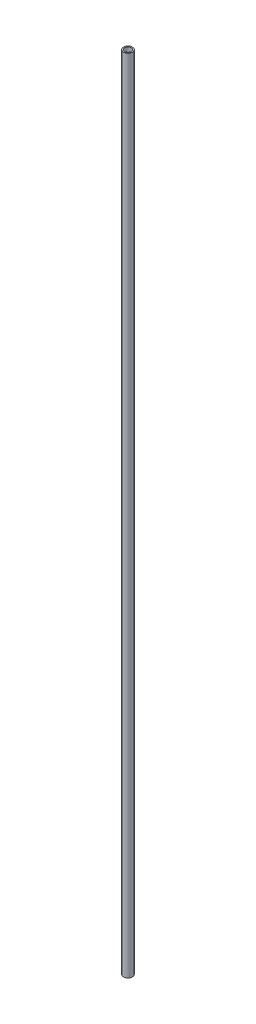
ISO-10303-21;
HEADER;
FILE_DESCRIPTION(('STEP AP214'),'2;1');
FILE_NAME('part.step','',(''),(''),'','','');
FILE_SCHEMA(('AUTOMOTIVE_DESIGN { 1 0 10303 214 1 1 1 1 }'));
ENDSEC;
DATA;
#1=APPLICATION_CONTEXT('core data for automotive mechanical design processes');
#2=APPLICATION_PROTOCOL_DEFINITION('international standard','automotive_design',2000,#1);
#3=PRODUCT_CONTEXT('',#1,'mechanical');
#4=PRODUCT('Part','Part','',(#3));
#5=PRODUCT_RELATED_PRODUCT_CATEGORY('part','',(#4));
#6=PRODUCT_DEFINITION_FORMATION('','',#4);
#7=PRODUCT_DEFINITION_CONTEXT('part definition',#1,'design');
#8=PRODUCT_DEFINITION('design','',#6,#7);
#9=PRODUCT_DEFINITION_SHAPE('','',#8);
#10=(LENGTH_UNIT() NAMED_UNIT(*) SI_UNIT(.MILLI.,.METRE.));
#11=(NAMED_UNIT(*) PLANE_ANGLE_UNIT() SI_UNIT($,.RADIAN.));
#12=(NAMED_UNIT(*) SI_UNIT($,.STERADIAN.) SOLID_ANGLE_UNIT());
#13=UNCERTAINTY_MEASURE_WITH_UNIT(LENGTH_MEASURE(1.E-05),#10,'distance_accuracy_value','');
#14=(GEOMETRIC_REPRESENTATION_CONTEXT(3) GLOBAL_UNCERTAINTY_ASSIGNED_CONTEXT((#13)) GLOBAL_UNIT_ASSIGNED_CONTEXT((#10,
#11,#12)) REPRESENTATION_CONTEXT('',''));
#15=CARTESIAN_POINT('',(0.,0.,0.));
#16=DIRECTION('',(0.,0.,1.));
#17=DIRECTION('',(1.,0.,0.));
#18=AXIS2_PLACEMENT_3D('',#15,#16,#17);
#19=CARTESIAN_POINT('',(0.,2339.34,0.));
#20=DIRECTION('',(0.,1.,0.));
#21=DIRECTION('',(0.,0.,1.));
#22=AXIS2_PLACEMENT_3D('',#19,#20,#21);
#23=PLANE('',#22);
#24=CARTESIAN_POINT('',(0.,2339.34,0.));
#25=DIRECTION('',(0.,1.,0.));
#26=DIRECTION('',(0.,0.,1.));
#27=AXIS2_PLACEMENT_3D('',#24,#25,#26);
#28=CIRCLE('',#27,13.);
#29=CARTESIAN_POINT('',(0.,2339.34,13.));
#30=VERTEX_POINT('',#29);
#31=EDGE_CURVE('E10',#30,#30,#28,.T.);
#32=ORIENTED_EDGE('',*,*,#31,.T.);
#33=EDGE_LOOP('',(#32));
#34=FACE_BOUND('',#33,.T.);
#35=CARTESIAN_POINT('',(0.,2339.34,0.));
#36=DIRECTION('',(0.,1.,0.));
#37=DIRECTION('',(0.,0.,1.));
#38=AXIS2_PLACEMENT_3D('',#35,#36,#37);
#39=CIRCLE('',#38,9.525);
#40=CARTESIAN_POINT('',(0.,2339.34,9.525));
#41=VERTEX_POINT('',#40);
#42=EDGE_CURVE('E57',#41,#41,#39,.T.);
#43=ORIENTED_EDGE('',*,*,#42,.F.);
#44=EDGE_LOOP('',(#43));
#45=FACE_BOUND('',#44,.T.);
#46=ADVANCED_FACE('F43',(#34,#45),#23,.T.);
#47=CARTESIAN_POINT('',(0.,0.,0.));
#48=DIRECTION('',(0.,1.,0.));
#49=DIRECTION('',(0.,0.,1.));
#50=AXIS2_PLACEMENT_3D('',#47,#48,#49);
#51=PLANE('',#50);
#52=CARTESIAN_POINT('',(0.,0.,0.));
#53=DIRECTION('',(0.,1.,0.));
#54=DIRECTION('',(0.,0.,1.));
#55=AXIS2_PLACEMENT_3D('',#52,#53,#54);
#56=CIRCLE('',#55,13.);
#57=CARTESIAN_POINT('',(0.,0.,13.));
#58=VERTEX_POINT('',#57);
#59=EDGE_CURVE('E50',#58,#58,#56,.T.);
#60=ORIENTED_EDGE('',*,*,#59,.F.);
#61=EDGE_LOOP('',(#60));
#62=FACE_BOUND('',#61,.T.);
#63=CARTESIAN_POINT('',(0.,0.,0.));
#64=DIRECTION('',(0.,1.,0.));
#65=DIRECTION('',(0.,0.,1.));
#66=AXIS2_PLACEMENT_3D('',#63,#64,#65);
#67=CIRCLE('',#66,9.525);
#68=CARTESIAN_POINT('',(0.,0.,9.525));
#69=VERTEX_POINT('',#68);
#70=EDGE_CURVE('E59',#69,#69,#67,.T.);
#71=ORIENTED_EDGE('',*,*,#70,.T.);
#72=EDGE_LOOP('',(#71));
#73=FACE_BOUND('',#72,.T.);
#74=ADVANCED_FACE('F68',(#62,#73),#51,.F.);
#75=CARTESIAN_POINT('',(0.,2339.34,0.));
#76=DIRECTION('',(0.,-1.,0.));
#77=DIRECTION('',(0.,0.,-1.));
#78=AXIS2_PLACEMENT_3D('',#75,#76,#77);
#79=CYLINDRICAL_SURFACE('',#78,13.);
#80=ORIENTED_EDGE('',*,*,#31,.F.);
#81=EDGE_LOOP('',(#80));
#82=FACE_BOUND('',#81,.T.);
#83=ORIENTED_EDGE('',*,*,#59,.T.);
#84=EDGE_LOOP('',(#83));
#85=FACE_BOUND('',#84,.T.);
#86=ADVANCED_FACE('F44',(#82,#85),#79,.T.);
#87=CARTESIAN_POINT('',(0.,2339.34,0.));
#88=DIRECTION('',(0.,-1.,0.));
#89=DIRECTION('',(0.,0.,-1.));
#90=AXIS2_PLACEMENT_3D('',#87,#88,#89);
#91=CYLINDRICAL_SURFACE('',#90,9.525);
#92=ORIENTED_EDGE('',*,*,#42,.T.);
#93=EDGE_LOOP('',(#92));
#94=FACE_BOUND('',#93,.T.);
#95=ORIENTED_EDGE('',*,*,#70,.F.);
#96=EDGE_LOOP('',(#95));
#97=FACE_BOUND('',#96,.T.);
#98=ADVANCED_FACE('F67',(#94,#97),#91,.F.);
#99=CLOSED_SHELL('',(#46,#74,#86,#98));
#100=MANIFOLD_SOLID_BREP('B2',#99);
#101=ADVANCED_BREP_SHAPE_REPRESENTATION('',(#18,#100),#14);
#102=SHAPE_DEFINITION_REPRESENTATION(#9,#101);
ENDSEC;
END-ISO-10303-21;
